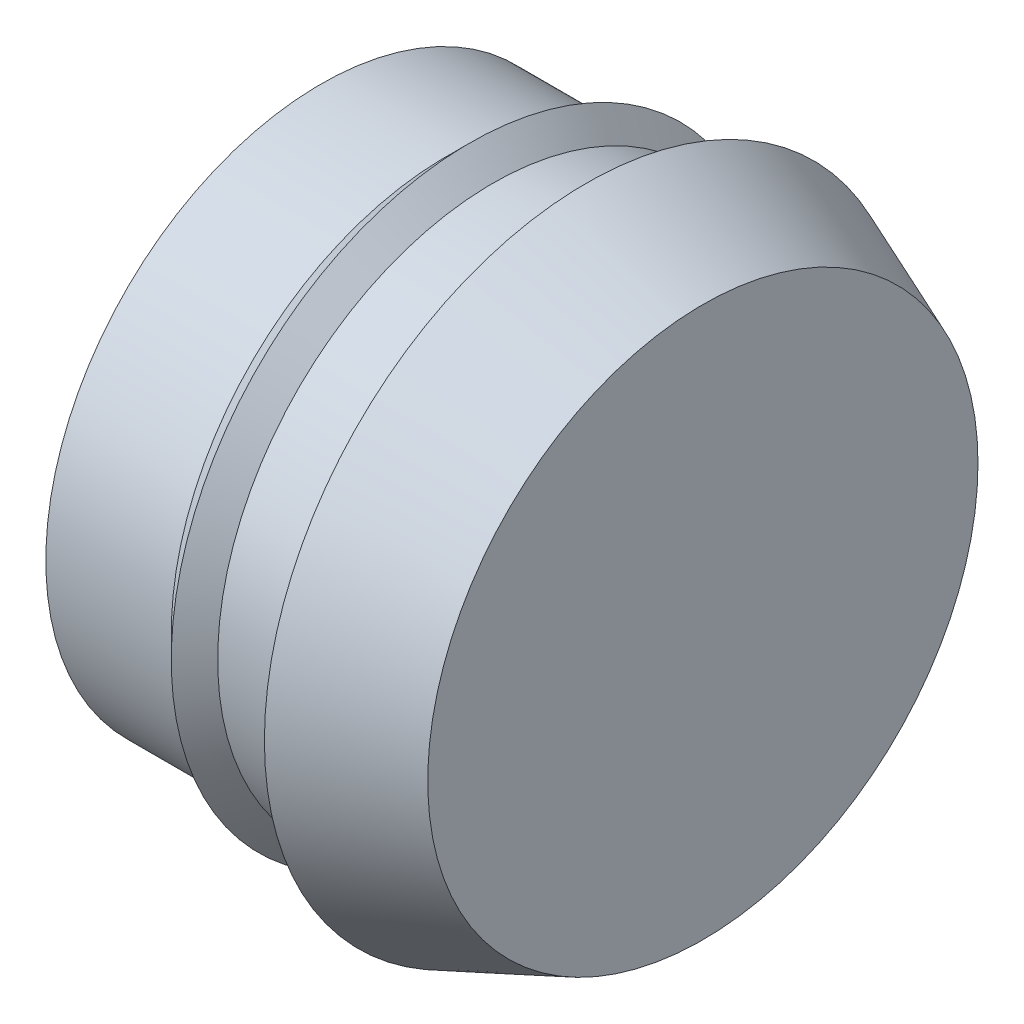
ISO-10303-21;
HEADER;
FILE_DESCRIPTION(('STEP AP214'),'2;1');
FILE_NAME('part.step','',(''),(''),'','','');
FILE_SCHEMA(('AUTOMOTIVE_DESIGN { 1 0 10303 214 1 1 1 1 }'));
ENDSEC;
DATA;
#1=APPLICATION_CONTEXT('core data for automotive mechanical design processes');
#2=APPLICATION_PROTOCOL_DEFINITION('international standard','automotive_design',2000,#1);
#3=PRODUCT_CONTEXT('',#1,'mechanical');
#4=PRODUCT('Part','Part','',(#3));
#5=PRODUCT_RELATED_PRODUCT_CATEGORY('part','',(#4));
#6=PRODUCT_DEFINITION_FORMATION('','',#4);
#7=PRODUCT_DEFINITION_CONTEXT('part definition',#1,'design');
#8=PRODUCT_DEFINITION('design','',#6,#7);
#9=PRODUCT_DEFINITION_SHAPE('','',#8);
#10=(LENGTH_UNIT() NAMED_UNIT(*) SI_UNIT(.MILLI.,.METRE.));
#11=(NAMED_UNIT(*) PLANE_ANGLE_UNIT() SI_UNIT($,.RADIAN.));
#12=(NAMED_UNIT(*) SI_UNIT($,.STERADIAN.) SOLID_ANGLE_UNIT());
#13=UNCERTAINTY_MEASURE_WITH_UNIT(LENGTH_MEASURE(1.E-05),#10,'distance_accuracy_value','');
#14=(GEOMETRIC_REPRESENTATION_CONTEXT(3) GLOBAL_UNCERTAINTY_ASSIGNED_CONTEXT((#13)) GLOBAL_UNIT_ASSIGNED_CONTEXT((#10,
#11,#12)) REPRESENTATION_CONTEXT('',''));
#15=CARTESIAN_POINT('',(0.,0.,0.));
#16=DIRECTION('',(0.,0.,1.));
#17=DIRECTION('',(1.,0.,0.));
#18=AXIS2_PLACEMENT_3D('',#15,#16,#17);
#19=CARTESIAN_POINT('',(0.,0.,0.));
#20=DIRECTION('',(1.,0.,0.));
#21=DIRECTION('',(0.,0.,-1.));
#22=AXIS2_PLACEMENT_3D('',#19,#20,#21);
#23=PLANE('',#22);
#24=CARTESIAN_POINT('',(0.,0.,0.));
#25=DIRECTION('',(1.,0.,0.));
#26=DIRECTION('',(0.,0.,-1.));
#27=AXIS2_PLACEMENT_3D('',#24,#25,#26);
#28=CIRCLE('',#27,9.365);
#29=CARTESIAN_POINT('',(0.,0.,-9.365));
#30=VERTEX_POINT('',#29);
#31=EDGE_CURVE('E10',#30,#30,#28,.T.);
#32=ORIENTED_EDGE('',*,*,#31,.T.);
#33=EDGE_LOOP('',(#32));
#34=FACE_BOUND('',#33,.T.);
#35=ADVANCED_FACE('F37',(#34),#23,.T.);
#36=CARTESIAN_POINT('',(0.,0.,0.));
#37=DIRECTION('',(-1.,0.,0.));
#38=DIRECTION('',(0.,0.,1.));
#39=AXIS2_PLACEMENT_3D('',#36,#37,#38);
#40=CONICAL_SURFACE('',#39,9.365,0.380940593324762);
#41=CARTESIAN_POINT('',(-3.97,0.,0.));
#42=DIRECTION('',(1.,0.,0.));
#43=DIRECTION('',(0.,0.,-1.));
#44=AXIS2_PLACEMENT_3D('',#41,#42,#43);
#45=CIRCLE('',#44,10.955);
#46=CARTESIAN_POINT('',(-3.97,0.,-10.955));
#47=VERTEX_POINT('',#46);
#48=EDGE_CURVE('E43',#47,#47,#45,.T.);
#49=ORIENTED_EDGE('',*,*,#48,.T.);
#50=EDGE_LOOP('',(#49));
#51=FACE_BOUND('',#50,.T.);
#52=ORIENTED_EDGE('',*,*,#31,.F.);
#53=EDGE_LOOP('',(#52));
#54=FACE_BOUND('',#53,.T.);
#55=ADVANCED_FACE('F78',(#51,#54),#40,.T.);
#56=CARTESIAN_POINT('',(-3.97,0.,-10.955));
#57=DIRECTION('',(-1.,0.,0.));
#58=DIRECTION('',(0.,0.,1.));
#59=AXIS2_PLACEMENT_3D('',#56,#57,#58);
#60=PLANE('',#59);
#61=CARTESIAN_POINT('',(-3.97,0.,0.));
#62=DIRECTION('',(1.,0.,0.));
#63=DIRECTION('',(0.,0.,-1.));
#64=AXIS2_PLACEMENT_3D('',#61,#62,#63);
#65=CIRCLE('',#64,9.365);
#66=CARTESIAN_POINT('',(-3.97,0.,-9.365));
#67=VERTEX_POINT('',#66);
#68=EDGE_CURVE('E47',#67,#67,#65,.T.);
#69=ORIENTED_EDGE('',*,*,#68,.T.);
#70=EDGE_LOOP('',(#69));
#71=FACE_BOUND('',#70,.T.);
#72=ORIENTED_EDGE('',*,*,#48,.F.);
#73=EDGE_LOOP('',(#72));
#74=FACE_BOUND('',#73,.T.);
#75=ADVANCED_FACE('F82',(#71,#74),#60,.T.);
#76=CARTESIAN_POINT('',(0.,0.,0.));
#77=DIRECTION('',(1.,0.,0.));
#78=DIRECTION('',(0.,0.,-1.));
#79=AXIS2_PLACEMENT_3D('',#76,#77,#78);
#80=CYLINDRICAL_SURFACE('',#79,9.365);
#81=CARTESIAN_POINT('',(-7.15,0.,0.));
#82=DIRECTION('',(1.,0.,0.));
#83=DIRECTION('',(0.,0.,-1.));
#84=AXIS2_PLACEMENT_3D('',#81,#82,#83);
#85=CIRCLE('',#84,9.365);
#86=CARTESIAN_POINT('',(-7.15,0.,-9.365));
#87=VERTEX_POINT('',#86);
#88=EDGE_CURVE('E51',#87,#87,#85,.T.);
#89=ORIENTED_EDGE('',*,*,#88,.T.);
#90=EDGE_LOOP('',(#89));
#91=FACE_BOUND('',#90,.T.);
#92=ORIENTED_EDGE('',*,*,#68,.F.);
#93=EDGE_LOOP('',(#92));
#94=FACE_BOUND('',#93,.T.);
#95=ADVANCED_FACE('F86',(#91,#94),#80,.T.);
#96=CARTESIAN_POINT('',(-7.15,0.,0.));
#97=DIRECTION('',(-1.,0.,0.));
#98=DIRECTION('',(0.,0.,1.));
#99=AXIS2_PLACEMENT_3D('',#96,#97,#98);
#100=CONICAL_SURFACE('',#99,9.365,0.785398163397449);
#101=CARTESIAN_POINT('',(-7.94,0.,0.));
#102=DIRECTION('',(1.,0.,0.));
#103=DIRECTION('',(0.,0.,-1.));
#104=AXIS2_PLACEMENT_3D('',#101,#102,#103);
#105=CIRCLE('',#104,10.155);
#106=CARTESIAN_POINT('',(-7.94,0.,-10.155));
#107=VERTEX_POINT('',#106);
#108=EDGE_CURVE('E56',#107,#107,#105,.T.);
#109=ORIENTED_EDGE('',*,*,#108,.T.);
#110=EDGE_LOOP('',(#109));
#111=FACE_BOUND('',#110,.T.);
#112=ORIENTED_EDGE('',*,*,#88,.F.);
#113=EDGE_LOOP('',(#112));
#114=FACE_BOUND('',#113,.T.);
#115=ADVANCED_FACE('F93',(#111,#114),#100,.T.);
#116=CARTESIAN_POINT('',(-7.94,0.,0.));
#117=DIRECTION('',(1.,0.,0.));
#118=DIRECTION('',(0.,0.,-1.));
#119=AXIS2_PLACEMENT_3D('',#116,#117,#118);
#120=CONICAL_SURFACE('',#119,10.155,0.785398163397448);
#121=CARTESIAN_POINT('',(-8.73,0.,0.));
#122=DIRECTION('',(1.,0.,0.));
#123=DIRECTION('',(0.,0.,-1.));
#124=AXIS2_PLACEMENT_3D('',#121,#122,#123);
#125=CIRCLE('',#124,9.365);
#126=CARTESIAN_POINT('',(-8.73,0.,-9.365));
#127=VERTEX_POINT('',#126);
#128=EDGE_CURVE('E59',#127,#127,#125,.T.);
#129=ORIENTED_EDGE('',*,*,#128,.T.);
#130=EDGE_LOOP('',(#129));
#131=FACE_BOUND('',#130,.T.);
#132=ORIENTED_EDGE('',*,*,#108,.F.);
#133=EDGE_LOOP('',(#132));
#134=FACE_BOUND('',#133,.T.);
#135=ADVANCED_FACE('F75',(#131,#134),#120,.T.);
#136=CARTESIAN_POINT('',(0.,0.,0.));
#137=DIRECTION('',(1.,0.,0.));
#138=DIRECTION('',(0.,0.,-1.));
#139=AXIS2_PLACEMENT_3D('',#136,#137,#138);
#140=CYLINDRICAL_SURFACE('',#139,9.365);
#141=CARTESIAN_POINT('',(-13.,0.,0.));
#142=DIRECTION('',(1.,0.,0.));
#143=DIRECTION('',(0.,0.,-1.));
#144=AXIS2_PLACEMENT_3D('',#141,#142,#143);
#145=CIRCLE('',#144,9.365);
#146=CARTESIAN_POINT('',(-13.,0.,-9.365));
#147=VERTEX_POINT('',#146);
#148=EDGE_CURVE('E62',#147,#147,#145,.T.);
#149=ORIENTED_EDGE('',*,*,#148,.T.);
#150=EDGE_LOOP('',(#149));
#151=FACE_BOUND('',#150,.T.);
#152=ORIENTED_EDGE('',*,*,#128,.F.);
#153=EDGE_LOOP('',(#152));
#154=FACE_BOUND('',#153,.T.);
#155=ADVANCED_FACE('F66',(#151,#154),#140,.T.);
#156=CARTESIAN_POINT('',(-13.,0.,-9.365));
#157=DIRECTION('',(-1.,0.,0.));
#158=DIRECTION('',(0.,0.,1.));
#159=AXIS2_PLACEMENT_3D('',#156,#157,#158);
#160=PLANE('',#159);
#161=ORIENTED_EDGE('',*,*,#148,.F.);
#162=EDGE_LOOP('',(#161));
#163=FACE_BOUND('',#162,.T.);
#164=ADVANCED_FACE('F69',(#163),#160,.T.);
#165=CLOSED_SHELL('',(#35,#55,#75,#95,#115,#135,#155,#164));
#166=MANIFOLD_SOLID_BREP('B2',#165);
#167=ADVANCED_BREP_SHAPE_REPRESENTATION('',(#18,#166),#14);
#168=SHAPE_DEFINITION_REPRESENTATION(#9,#167);
ENDSEC;
END-ISO-10303-21;
